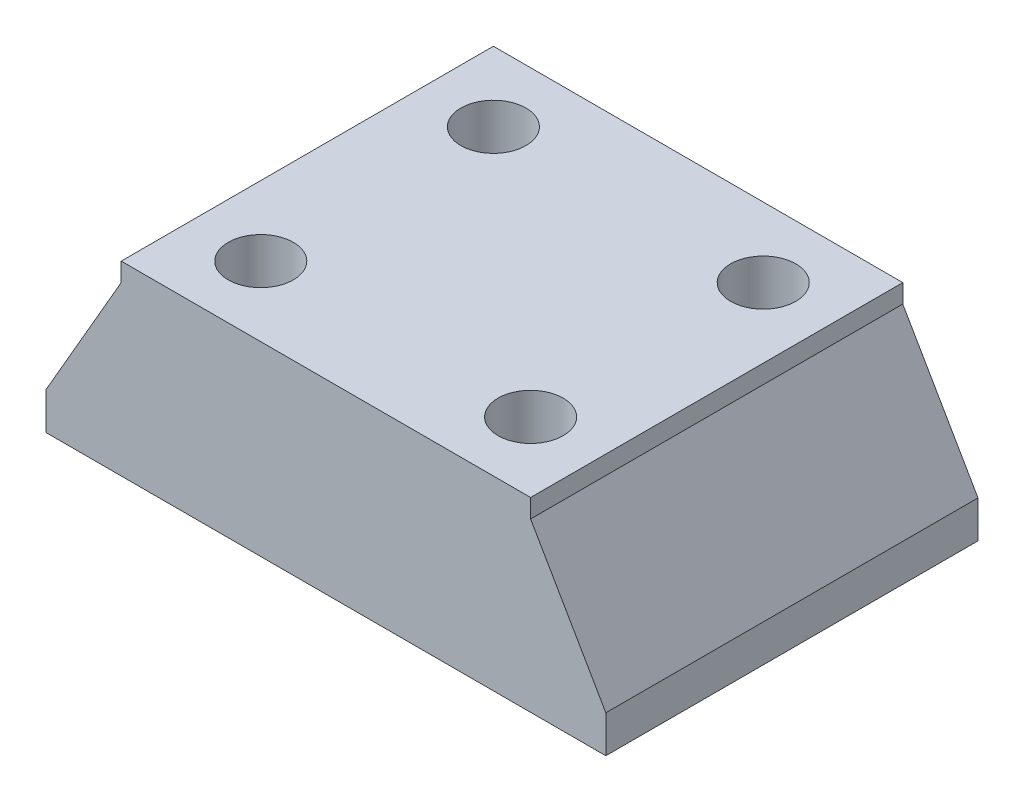
ISO-10303-21;
HEADER;
FILE_DESCRIPTION(('STEP AP214'),'2;1');
FILE_NAME('part.step','',(''),(''),'','','');
FILE_SCHEMA(('AUTOMOTIVE_DESIGN { 1 0 10303 214 1 1 1 1 }'));
ENDSEC;
DATA;
#1=APPLICATION_CONTEXT('core data for automotive mechanical design processes');
#2=APPLICATION_PROTOCOL_DEFINITION('international standard','automotive_design',2000,#1);
#3=PRODUCT_CONTEXT('',#1,'mechanical');
#4=PRODUCT('Part','Part','',(#3));
#5=PRODUCT_RELATED_PRODUCT_CATEGORY('part','',(#4));
#6=PRODUCT_DEFINITION_FORMATION('','',#4);
#7=PRODUCT_DEFINITION_CONTEXT('part definition',#1,'design');
#8=PRODUCT_DEFINITION('design','',#6,#7);
#9=PRODUCT_DEFINITION_SHAPE('','',#8);
#10=(LENGTH_UNIT() NAMED_UNIT(*) SI_UNIT(.MILLI.,.METRE.));
#11=(NAMED_UNIT(*) PLANE_ANGLE_UNIT() SI_UNIT($,.RADIAN.));
#12=(NAMED_UNIT(*) SI_UNIT($,.STERADIAN.) SOLID_ANGLE_UNIT());
#13=UNCERTAINTY_MEASURE_WITH_UNIT(LENGTH_MEASURE(1.E-05),#10,'distance_accuracy_value','');
#14=(GEOMETRIC_REPRESENTATION_CONTEXT(3) GLOBAL_UNCERTAINTY_ASSIGNED_CONTEXT((#13)) GLOBAL_UNIT_ASSIGNED_CONTEXT((#10,
#11,#12)) REPRESENTATION_CONTEXT('',''));
#15=CARTESIAN_POINT('',(0.,0.,0.));
#16=DIRECTION('',(0.,0.,1.));
#17=DIRECTION('',(1.,0.,0.));
#18=AXIS2_PLACEMENT_3D('',#15,#16,#17);
#19=CARTESIAN_POINT('',(-15.0414518843274,1.99999999999999,10.));
#20=DIRECTION('',(1.,0.,0.));
#21=DIRECTION('',(0.,0.,-1.));
#22=AXIS2_PLACEMENT_3D('',#19,#20,#21);
#23=PLANE('',#22);
#24=DIRECTION('',(0.,-1.,0.));
#25=VECTOR('',#24,1.);
#26=CARTESIAN_POINT('',(-15.0414518843274,1.99999999999999,-10.));
#27=LINE('',#26,#25);
#28=CARTESIAN_POINT('',(-15.0414518843274,1.99999999999999,-10.));
#29=VERTEX_POINT('',#28);
#30=CARTESIAN_POINT('',(-15.0414518843274,0.,-10.));
#31=VERTEX_POINT('',#30);
#32=EDGE_CURVE('E129',#29,#31,#27,.T.);
#33=ORIENTED_EDGE('',*,*,#32,.T.);
#34=DIRECTION('',(0.,0.,-1.));
#35=VECTOR('',#34,1.);
#36=CARTESIAN_POINT('',(-15.0414518843274,0.,10.));
#37=LINE('',#36,#35);
#38=CARTESIAN_POINT('',(-15.0414518843274,0.,10.));
#39=VERTEX_POINT('',#38);
#40=EDGE_CURVE('E11',#39,#31,#37,.T.);
#41=ORIENTED_EDGE('',*,*,#40,.F.);
#42=DIRECTION('',(0.,-1.,0.));
#43=VECTOR('',#42,1.);
#44=CARTESIAN_POINT('',(-15.0414518843274,1.99999999999999,10.));
#45=LINE('',#44,#43);
#46=CARTESIAN_POINT('',(-15.0414518843274,1.99999999999999,10.));
#47=VERTEX_POINT('',#46);
#48=EDGE_CURVE('E144',#47,#39,#45,.T.);
#49=ORIENTED_EDGE('',*,*,#48,.F.);
#50=DIRECTION('',(0.,0.,-1.));
#51=VECTOR('',#50,1.);
#52=CARTESIAN_POINT('',(-15.0414518843274,1.99999999999999,10.));
#53=LINE('',#52,#51);
#54=EDGE_CURVE('E125',#47,#29,#53,.T.);
#55=ORIENTED_EDGE('',*,*,#54,.T.);
#56=EDGE_LOOP('',(#33,#41,#49,#55));
#57=FACE_BOUND('',#56,.T.);
#58=ADVANCED_FACE('F33',(#57),#23,.F.);
#59=CARTESIAN_POINT('',(-15.0414518843274,0.,10.));
#60=DIRECTION('',(0.,1.,0.));
#61=DIRECTION('',(-1.,0.,0.));
#62=AXIS2_PLACEMENT_3D('',#59,#60,#61);
#63=PLANE('',#62);
#64=CARTESIAN_POINT('',(7.25,0.,6.25));
#65=DIRECTION('',(0.,1.,0.));
#66=DIRECTION('',(-1.,0.,0.));
#67=AXIS2_PLACEMENT_3D('',#64,#65,#66);
#68=CIRCLE('',#67,1.75);
#69=CARTESIAN_POINT('',(5.5,0.,6.25));
#70=VERTEX_POINT('',#69);
#71=EDGE_CURVE('E192',#70,#70,#68,.T.);
#72=ORIENTED_EDGE('',*,*,#71,.T.);
#73=EDGE_LOOP('',(#72));
#74=FACE_BOUND('',#73,.T.);
#75=CARTESIAN_POINT('',(-7.25,0.,6.25));
#76=DIRECTION('',(0.,1.,0.));
#77=DIRECTION('',(-1.,0.,0.));
#78=AXIS2_PLACEMENT_3D('',#75,#76,#77);
#79=CIRCLE('',#78,1.75);
#80=CARTESIAN_POINT('',(-9.,0.,6.25));
#81=VERTEX_POINT('',#80);
#82=EDGE_CURVE('E186',#81,#81,#79,.T.);
#83=ORIENTED_EDGE('',*,*,#82,.T.);
#84=EDGE_LOOP('',(#83));
#85=FACE_BOUND('',#84,.T.);
#86=CARTESIAN_POINT('',(-7.25,0.,-6.25));
#87=DIRECTION('',(0.,1.,0.));
#88=DIRECTION('',(-1.,0.,0.));
#89=AXIS2_PLACEMENT_3D('',#86,#87,#88);
#90=CIRCLE('',#89,1.75);
#91=CARTESIAN_POINT('',(-9.,0.,-6.25));
#92=VERTEX_POINT('',#91);
#93=EDGE_CURVE('E180',#92,#92,#90,.T.);
#94=ORIENTED_EDGE('',*,*,#93,.T.);
#95=EDGE_LOOP('',(#94));
#96=FACE_BOUND('',#95,.T.);
#97=CARTESIAN_POINT('',(7.25,0.,-6.25));
#98=DIRECTION('',(0.,1.,0.));
#99=DIRECTION('',(-1.,0.,0.));
#100=AXIS2_PLACEMENT_3D('',#97,#98,#99);
#101=CIRCLE('',#100,1.75);
#102=CARTESIAN_POINT('',(5.5,0.,-6.25));
#103=VERTEX_POINT('',#102);
#104=EDGE_CURVE('E133',#103,#103,#101,.T.);
#105=ORIENTED_EDGE('',*,*,#104,.T.);
#106=EDGE_LOOP('',(#105));
#107=FACE_BOUND('',#106,.T.);
#108=DIRECTION('',(1.,0.,0.));
#109=VECTOR('',#108,1.);
#110=CARTESIAN_POINT('',(-15.0414518843274,0.,-10.));
#111=LINE('',#110,#109);
#112=CARTESIAN_POINT('',(15.0414518843274,0.,-10.));
#113=VERTEX_POINT('',#112);
#114=EDGE_CURVE('E132',#31,#113,#111,.T.);
#115=ORIENTED_EDGE('',*,*,#114,.T.);
#116=DIRECTION('',(0.,0.,-1.));
#117=VECTOR('',#116,1.);
#118=CARTESIAN_POINT('',(15.0414518843274,0.,10.));
#119=LINE('',#118,#117);
#120=CARTESIAN_POINT('',(15.0414518843274,0.,10.));
#121=VERTEX_POINT('',#120);
#122=EDGE_CURVE('E41',#121,#113,#119,.T.);
#123=ORIENTED_EDGE('',*,*,#122,.F.);
#124=DIRECTION('',(1.,0.,0.));
#125=VECTOR('',#124,1.);
#126=CARTESIAN_POINT('',(-15.0414518843274,0.,10.));
#127=LINE('',#126,#125);
#128=EDGE_CURVE('E92',#39,#121,#127,.T.);
#129=ORIENTED_EDGE('',*,*,#128,.F.);
#130=ORIENTED_EDGE('',*,*,#40,.T.);
#131=EDGE_LOOP('',(#115,#123,#129,#130));
#132=FACE_BOUND('',#131,.T.);
#133=ADVANCED_FACE('F201',(#74,#85,#96,#107,#132),#63,.F.);
#134=CARTESIAN_POINT('',(15.0414518843274,2.,10.));
#135=DIRECTION('',(-1.,0.,0.));
#136=DIRECTION('',(0.,-1.,0.));
#137=AXIS2_PLACEMENT_3D('',#134,#135,#136);
#138=PLANE('',#137);
#139=DIRECTION('',(0.,1.,0.));
#140=VECTOR('',#139,1.);
#141=CARTESIAN_POINT('',(15.0414518843274,2.,-10.));
#142=LINE('',#141,#140);
#143=CARTESIAN_POINT('',(15.0414518843274,2.,-10.));
#144=VERTEX_POINT('',#143);
#145=EDGE_CURVE('E135',#113,#144,#142,.T.);
#146=ORIENTED_EDGE('',*,*,#145,.T.);
#147=DIRECTION('',(0.,0.,-1.));
#148=VECTOR('',#147,1.);
#149=CARTESIAN_POINT('',(15.0414518843274,2.,10.));
#150=LINE('',#149,#148);
#151=CARTESIAN_POINT('',(15.0414518843274,2.,10.));
#152=VERTEX_POINT('',#151);
#153=EDGE_CURVE('E151',#152,#144,#150,.T.);
#154=ORIENTED_EDGE('',*,*,#153,.F.);
#155=DIRECTION('',(0.,1.,0.));
#156=VECTOR('',#155,1.);
#157=CARTESIAN_POINT('',(15.0414518843274,2.,10.));
#158=LINE('',#157,#156);
#159=EDGE_CURVE('E159',#121,#152,#158,.T.);
#160=ORIENTED_EDGE('',*,*,#159,.F.);
#161=ORIENTED_EDGE('',*,*,#122,.T.);
#162=EDGE_LOOP('',(#146,#154,#160,#161));
#163=FACE_BOUND('',#162,.T.);
#164=ADVANCED_FACE('F157',(#163),#138,.F.);
#165=CARTESIAN_POINT('',(11.,9.,10.));
#166=DIRECTION('',(-0.866025403784438,-0.500000000000001,0.));
#167=DIRECTION('',(0.500000000000001,-0.866025403784438,0.));
#168=AXIS2_PLACEMENT_3D('',#165,#166,#167);
#169=PLANE('',#168);
#170=DIRECTION('',(-0.500000000000001,0.866025403784438,0.));
#171=VECTOR('',#170,1.);
#172=CARTESIAN_POINT('',(11.,9.,-10.));
#173=LINE('',#172,#171);
#174=CARTESIAN_POINT('',(11.,9.,-10.));
#175=VERTEX_POINT('',#174);
#176=EDGE_CURVE('E137',#144,#175,#173,.T.);
#177=ORIENTED_EDGE('',*,*,#176,.T.);
#178=DIRECTION('',(0.,0.,-1.));
#179=VECTOR('',#178,1.);
#180=CARTESIAN_POINT('',(11.,9.,10.));
#181=LINE('',#180,#179);
#182=CARTESIAN_POINT('',(11.,9.,10.));
#183=VERTEX_POINT('',#182);
#184=EDGE_CURVE('E148',#183,#175,#181,.T.);
#185=ORIENTED_EDGE('',*,*,#184,.F.);
#186=DIRECTION('',(-0.500000000000001,0.866025403784438,0.));
#187=VECTOR('',#186,1.);
#188=CARTESIAN_POINT('',(11.,9.,10.));
#189=LINE('',#188,#187);
#190=EDGE_CURVE('E171',#152,#183,#189,.T.);
#191=ORIENTED_EDGE('',*,*,#190,.F.);
#192=ORIENTED_EDGE('',*,*,#153,.T.);
#193=EDGE_LOOP('',(#177,#185,#191,#192));
#194=FACE_BOUND('',#193,.T.);
#195=ADVANCED_FACE('F167',(#194),#169,.F.);
#196=CARTESIAN_POINT('',(11.,9.,10.));
#197=DIRECTION('',(-1.,0.,0.));
#198=DIRECTION('',(0.,-1.,0.));
#199=AXIS2_PLACEMENT_3D('',#196,#197,#198);
#200=PLANE('',#199);
#201=DIRECTION('',(0.,1.,0.));
#202=VECTOR('',#201,1.);
#203=CARTESIAN_POINT('',(11.,9.,-10.));
#204=LINE('',#203,#202);
#205=CARTESIAN_POINT('',(11.,10.,-10.));
#206=VERTEX_POINT('',#205);
#207=EDGE_CURVE('E139',#175,#206,#204,.T.);
#208=ORIENTED_EDGE('',*,*,#207,.T.);
#209=DIRECTION('',(0.,0.,-1.));
#210=VECTOR('',#209,1.);
#211=CARTESIAN_POINT('',(11.,10.,10.));
#212=LINE('',#211,#210);
#213=CARTESIAN_POINT('',(11.,10.,10.));
#214=VERTEX_POINT('',#213);
#215=EDGE_CURVE('E120',#214,#206,#212,.T.);
#216=ORIENTED_EDGE('',*,*,#215,.F.);
#217=DIRECTION('',(0.,1.,0.));
#218=VECTOR('',#217,1.);
#219=CARTESIAN_POINT('',(11.,9.,10.));
#220=LINE('',#219,#218);
#221=EDGE_CURVE('E111',#183,#214,#220,.T.);
#222=ORIENTED_EDGE('',*,*,#221,.F.);
#223=ORIENTED_EDGE('',*,*,#184,.T.);
#224=EDGE_LOOP('',(#208,#216,#222,#223));
#225=FACE_BOUND('',#224,.T.);
#226=ADVANCED_FACE('F170',(#225),#200,.F.);
#227=CARTESIAN_POINT('',(-11.,10.,10.));
#228=DIRECTION('',(0.,-1.,0.));
#229=DIRECTION('',(1.,0.,0.));
#230=AXIS2_PLACEMENT_3D('',#227,#228,#229);
#231=PLANE('',#230);
#232=CARTESIAN_POINT('',(7.25,10.,6.25));
#233=DIRECTION('',(0.,1.,0.));
#234=DIRECTION('',(-1.,0.,0.));
#235=AXIS2_PLACEMENT_3D('',#232,#233,#234);
#236=CIRCLE('',#235,1.75);
#237=CARTESIAN_POINT('',(5.5,10.,6.25));
#238=VERTEX_POINT('',#237);
#239=EDGE_CURVE('E195',#238,#238,#236,.T.);
#240=ORIENTED_EDGE('',*,*,#239,.F.);
#241=EDGE_LOOP('',(#240));
#242=FACE_BOUND('',#241,.T.);
#243=CARTESIAN_POINT('',(-7.25,10.,6.25));
#244=DIRECTION('',(0.,1.,0.));
#245=DIRECTION('',(-1.,0.,0.));
#246=AXIS2_PLACEMENT_3D('',#243,#244,#245);
#247=CIRCLE('',#246,1.75);
#248=CARTESIAN_POINT('',(-9.,10.,6.25));
#249=VERTEX_POINT('',#248);
#250=EDGE_CURVE('E189',#249,#249,#247,.T.);
#251=ORIENTED_EDGE('',*,*,#250,.F.);
#252=EDGE_LOOP('',(#251));
#253=FACE_BOUND('',#252,.T.);
#254=CARTESIAN_POINT('',(-7.25,10.,-6.25));
#255=DIRECTION('',(0.,1.,0.));
#256=DIRECTION('',(-1.,0.,0.));
#257=AXIS2_PLACEMENT_3D('',#254,#255,#256);
#258=CIRCLE('',#257,1.75);
#259=CARTESIAN_POINT('',(-9.,10.,-6.25));
#260=VERTEX_POINT('',#259);
#261=EDGE_CURVE('E183',#260,#260,#258,.T.);
#262=ORIENTED_EDGE('',*,*,#261,.F.);
#263=EDGE_LOOP('',(#262));
#264=FACE_BOUND('',#263,.T.);
#265=CARTESIAN_POINT('',(7.25,10.,-6.25));
#266=DIRECTION('',(0.,1.,0.));
#267=DIRECTION('',(-1.,0.,0.));
#268=AXIS2_PLACEMENT_3D('',#265,#266,#267);
#269=CIRCLE('',#268,1.75);
#270=CARTESIAN_POINT('',(5.5,10.,-6.25));
#271=VERTEX_POINT('',#270);
#272=EDGE_CURVE('E177',#271,#271,#269,.T.);
#273=ORIENTED_EDGE('',*,*,#272,.F.);
#274=EDGE_LOOP('',(#273));
#275=FACE_BOUND('',#274,.T.);
#276=DIRECTION('',(-1.,0.,0.));
#277=VECTOR('',#276,1.);
#278=CARTESIAN_POINT('',(-11.,10.,-10.));
#279=LINE('',#278,#277);
#280=CARTESIAN_POINT('',(-11.,10.,-10.));
#281=VERTEX_POINT('',#280);
#282=EDGE_CURVE('E119',#206,#281,#279,.T.);
#283=ORIENTED_EDGE('',*,*,#282,.T.);
#284=DIRECTION('',(0.,0.,-1.));
#285=VECTOR('',#284,1.);
#286=CARTESIAN_POINT('',(-11.,10.,10.));
#287=LINE('',#286,#285);
#288=CARTESIAN_POINT('',(-11.,10.,10.));
#289=VERTEX_POINT('',#288);
#290=EDGE_CURVE('E116',#289,#281,#287,.T.);
#291=ORIENTED_EDGE('',*,*,#290,.F.);
#292=DIRECTION('',(-1.,0.,0.));
#293=VECTOR('',#292,1.);
#294=CARTESIAN_POINT('',(-11.,10.,10.));
#295=LINE('',#294,#293);
#296=EDGE_CURVE('E105',#214,#289,#295,.T.);
#297=ORIENTED_EDGE('',*,*,#296,.F.);
#298=ORIENTED_EDGE('',*,*,#215,.T.);
#299=EDGE_LOOP('',(#283,#291,#297,#298));
#300=FACE_BOUND('',#299,.T.);
#301=ADVANCED_FACE('F117',(#242,#253,#264,#275,#300),#231,.F.);
#302=CARTESIAN_POINT('',(-11.,9.,10.));
#303=DIRECTION('',(1.,0.,0.));
#304=DIRECTION('',(0.,1.,0.));
#305=AXIS2_PLACEMENT_3D('',#302,#303,#304);
#306=PLANE('',#305);
#307=DIRECTION('',(0.,-1.,0.));
#308=VECTOR('',#307,1.);
#309=CARTESIAN_POINT('',(-11.,9.,-10.));
#310=LINE('',#309,#308);
#311=CARTESIAN_POINT('',(-11.,9.,-10.));
#312=VERTEX_POINT('',#311);
#313=EDGE_CURVE('E78',#281,#312,#310,.T.);
#314=ORIENTED_EDGE('',*,*,#313,.T.);
#315=DIRECTION('',(0.,0.,-1.));
#316=VECTOR('',#315,1.);
#317=CARTESIAN_POINT('',(-11.,9.,10.));
#318=LINE('',#317,#316);
#319=CARTESIAN_POINT('',(-11.,9.,10.));
#320=VERTEX_POINT('',#319);
#321=EDGE_CURVE('E121',#320,#312,#318,.T.);
#322=ORIENTED_EDGE('',*,*,#321,.F.);
#323=DIRECTION('',(0.,-1.,0.));
#324=VECTOR('',#323,1.);
#325=CARTESIAN_POINT('',(-11.,9.,10.));
#326=LINE('',#325,#324);
#327=EDGE_CURVE('E109',#289,#320,#326,.T.);
#328=ORIENTED_EDGE('',*,*,#327,.F.);
#329=ORIENTED_EDGE('',*,*,#290,.T.);
#330=EDGE_LOOP('',(#314,#322,#328,#329));
#331=FACE_BOUND('',#330,.T.);
#332=ADVANCED_FACE('F123',(#331),#306,.F.);
#333=CARTESIAN_POINT('',(-11.,9.,10.));
#334=DIRECTION('',(0.866025403784438,-0.500000000000001,0.));
#335=DIRECTION('',(0.500000000000001,0.866025403784438,0.));
#336=AXIS2_PLACEMENT_3D('',#333,#334,#335);
#337=PLANE('',#336);
#338=DIRECTION('',(-0.500000000000001,-0.866025403784438,0.));
#339=VECTOR('',#338,1.);
#340=CARTESIAN_POINT('',(-11.,9.,-10.));
#341=LINE('',#340,#339);
#342=EDGE_CURVE('E84',#312,#29,#341,.T.);
#343=ORIENTED_EDGE('',*,*,#342,.T.);
#344=ORIENTED_EDGE('',*,*,#54,.F.);
#345=DIRECTION('',(-0.500000000000001,-0.866025403784438,0.));
#346=VECTOR('',#345,1.);
#347=CARTESIAN_POINT('',(-11.,9.,10.));
#348=LINE('',#347,#346);
#349=EDGE_CURVE('E49',#320,#47,#348,.T.);
#350=ORIENTED_EDGE('',*,*,#349,.F.);
#351=ORIENTED_EDGE('',*,*,#321,.T.);
#352=EDGE_LOOP('',(#343,#344,#350,#351));
#353=FACE_BOUND('',#352,.T.);
#354=ADVANCED_FACE('F241',(#353),#337,.F.);
#355=CARTESIAN_POINT('',(0.,0.,10.));
#356=DIRECTION('',(0.,0.,1.));
#357=DIRECTION('',(1.,0.,0.));
#358=AXIS2_PLACEMENT_3D('',#355,#356,#357);
#359=PLANE('',#358);
#360=ORIENTED_EDGE('',*,*,#48,.T.);
#361=ORIENTED_EDGE('',*,*,#128,.T.);
#362=ORIENTED_EDGE('',*,*,#159,.T.);
#363=ORIENTED_EDGE('',*,*,#190,.T.);
#364=ORIENTED_EDGE('',*,*,#221,.T.);
#365=ORIENTED_EDGE('',*,*,#296,.T.);
#366=ORIENTED_EDGE('',*,*,#327,.T.);
#367=ORIENTED_EDGE('',*,*,#349,.T.);
#368=EDGE_LOOP('',(#360,#361,#362,#363,#364,#365,#366,#367));
#369=FACE_BOUND('',#368,.T.);
#370=ADVANCED_FACE('F107',(#369),#359,.T.);
#371=CARTESIAN_POINT('',(0.,0.,-10.));
#372=DIRECTION('',(0.,0.,1.));
#373=DIRECTION('',(1.,0.,0.));
#374=AXIS2_PLACEMENT_3D('',#371,#372,#373);
#375=PLANE('',#374);
#376=ORIENTED_EDGE('',*,*,#32,.F.);
#377=ORIENTED_EDGE('',*,*,#342,.F.);
#378=ORIENTED_EDGE('',*,*,#313,.F.);
#379=ORIENTED_EDGE('',*,*,#282,.F.);
#380=ORIENTED_EDGE('',*,*,#207,.F.);
#381=ORIENTED_EDGE('',*,*,#176,.F.);
#382=ORIENTED_EDGE('',*,*,#145,.F.);
#383=ORIENTED_EDGE('',*,*,#114,.F.);
#384=EDGE_LOOP('',(#376,#377,#378,#379,#380,#381,#382,#383));
#385=FACE_BOUND('',#384,.T.);
#386=ADVANCED_FACE('F163',(#385),#375,.F.);
#387=CARTESIAN_POINT('',(7.25,0.,-6.25));
#388=DIRECTION('',(0.,1.,0.));
#389=DIRECTION('',(-1.,0.,0.));
#390=AXIS2_PLACEMENT_3D('',#387,#388,#389);
#391=CYLINDRICAL_SURFACE('',#390,1.75);
#392=ORIENTED_EDGE('',*,*,#104,.F.);
#393=EDGE_LOOP('',(#392));
#394=FACE_BOUND('',#393,.T.);
#395=ORIENTED_EDGE('',*,*,#272,.T.);
#396=EDGE_LOOP('',(#395));
#397=FACE_BOUND('',#396,.T.);
#398=ADVANCED_FACE('F220',(#394,#397),#391,.F.);
#399=CARTESIAN_POINT('',(-7.25,0.,-6.25));
#400=DIRECTION('',(0.,1.,0.));
#401=DIRECTION('',(-1.,0.,0.));
#402=AXIS2_PLACEMENT_3D('',#399,#400,#401);
#403=CYLINDRICAL_SURFACE('',#402,1.75);
#404=ORIENTED_EDGE('',*,*,#93,.F.);
#405=EDGE_LOOP('',(#404));
#406=FACE_BOUND('',#405,.T.);
#407=ORIENTED_EDGE('',*,*,#261,.T.);
#408=EDGE_LOOP('',(#407));
#409=FACE_BOUND('',#408,.T.);
#410=ADVANCED_FACE('F222',(#406,#409),#403,.F.);
#411=CARTESIAN_POINT('',(-7.25,0.,6.25));
#412=DIRECTION('',(0.,1.,0.));
#413=DIRECTION('',(-1.,0.,0.));
#414=AXIS2_PLACEMENT_3D('',#411,#412,#413);
#415=CYLINDRICAL_SURFACE('',#414,1.75);
#416=ORIENTED_EDGE('',*,*,#82,.F.);
#417=EDGE_LOOP('',(#416));
#418=FACE_BOUND('',#417,.T.);
#419=ORIENTED_EDGE('',*,*,#250,.T.);
#420=EDGE_LOOP('',(#419));
#421=FACE_BOUND('',#420,.T.);
#422=ADVANCED_FACE('F207',(#418,#421),#415,.F.);
#423=CARTESIAN_POINT('',(7.25,0.,6.25));
#424=DIRECTION('',(0.,1.,0.));
#425=DIRECTION('',(-1.,0.,0.));
#426=AXIS2_PLACEMENT_3D('',#423,#424,#425);
#427=CYLINDRICAL_SURFACE('',#426,1.75);
#428=ORIENTED_EDGE('',*,*,#71,.F.);
#429=EDGE_LOOP('',(#428));
#430=FACE_BOUND('',#429,.T.);
#431=ORIENTED_EDGE('',*,*,#239,.T.);
#432=EDGE_LOOP('',(#431));
#433=FACE_BOUND('',#432,.T.);
#434=ADVANCED_FACE('F204',(#430,#433),#427,.F.);
#435=CLOSED_SHELL('',(#58,#133,#164,#195,#226,#301,#332,#354,#370,#386,#398,#410,#422,#434));
#436=MANIFOLD_SOLID_BREP('B2',#435);
#437=ADVANCED_BREP_SHAPE_REPRESENTATION('',(#18,#436),#14);
#438=SHAPE_DEFINITION_REPRESENTATION(#9,#437);
ENDSEC;
END-ISO-10303-21;
